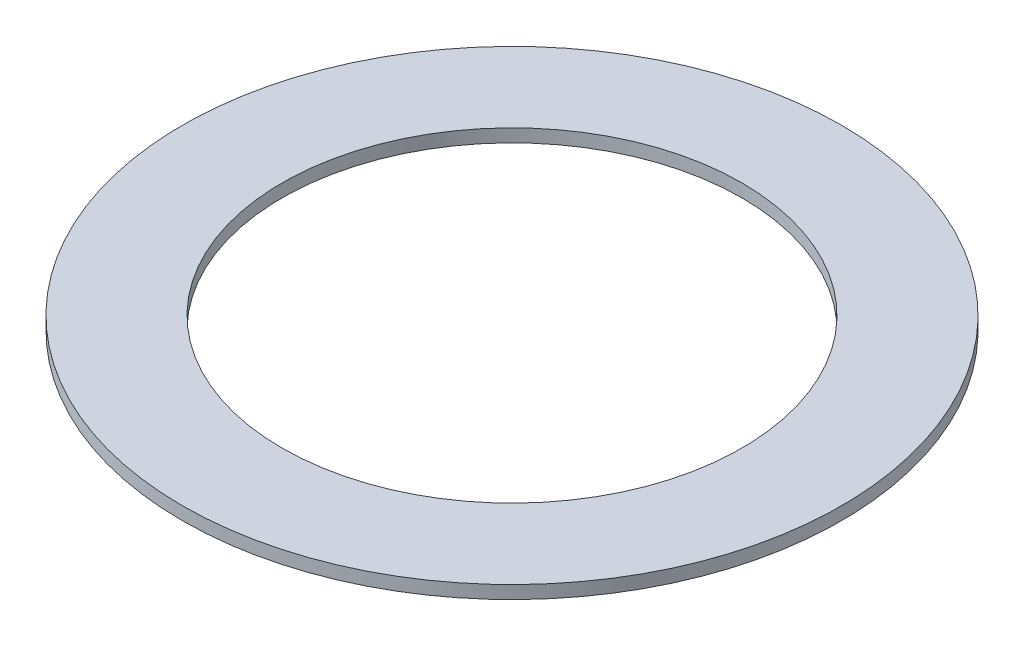
ISO-10303-21;
HEADER;
FILE_DESCRIPTION(('STEP AP214'),'2;1');
FILE_NAME('part.step','',(''),(''),'','','');
FILE_SCHEMA(('AUTOMOTIVE_DESIGN { 1 0 10303 214 1 1 1 1 }'));
ENDSEC;
DATA;
#1=APPLICATION_CONTEXT('core data for automotive mechanical design processes');
#2=APPLICATION_PROTOCOL_DEFINITION('international standard','automotive_design',2000,#1);
#3=PRODUCT_CONTEXT('',#1,'mechanical');
#4=PRODUCT('Part','Part','',(#3));
#5=PRODUCT_RELATED_PRODUCT_CATEGORY('part','',(#4));
#6=PRODUCT_DEFINITION_FORMATION('','',#4);
#7=PRODUCT_DEFINITION_CONTEXT('part definition',#1,'design');
#8=PRODUCT_DEFINITION('design','',#6,#7);
#9=PRODUCT_DEFINITION_SHAPE('','',#8);
#10=(LENGTH_UNIT() NAMED_UNIT(*) SI_UNIT(.MILLI.,.METRE.));
#11=(NAMED_UNIT(*) PLANE_ANGLE_UNIT() SI_UNIT($,.RADIAN.));
#12=(NAMED_UNIT(*) SI_UNIT($,.STERADIAN.) SOLID_ANGLE_UNIT());
#13=UNCERTAINTY_MEASURE_WITH_UNIT(LENGTH_MEASURE(1.E-05),#10,'distance_accuracy_value','');
#14=(GEOMETRIC_REPRESENTATION_CONTEXT(3) GLOBAL_UNCERTAINTY_ASSIGNED_CONTEXT((#13)) GLOBAL_UNIT_ASSIGNED_CONTEXT((#10,
#11,#12)) REPRESENTATION_CONTEXT('',''));
#15=CARTESIAN_POINT('',(0.,0.,0.));
#16=DIRECTION('',(0.,0.,1.));
#17=DIRECTION('',(1.,0.,0.));
#18=AXIS2_PLACEMENT_3D('',#15,#16,#17);
#19=CARTESIAN_POINT('',(0.,0.3,0.));
#20=DIRECTION('',(0.,1.,0.));
#21=DIRECTION('',(0.,0.,1.));
#22=AXIS2_PLACEMENT_3D('',#19,#20,#21);
#23=PLANE('',#22);
#24=CARTESIAN_POINT('',(0.,0.3,0.));
#25=DIRECTION('',(0.,1.,0.));
#26=DIRECTION('',(0.,0.,1.));
#27=AXIS2_PLACEMENT_3D('',#24,#25,#26);
#28=CIRCLE('',#27,7.6);
#29=CARTESIAN_POINT('',(0.,0.3,7.6));
#30=VERTEX_POINT('',#29);
#31=EDGE_CURVE('E10',#30,#30,#28,.T.);
#32=ORIENTED_EDGE('',*,*,#31,.T.);
#33=EDGE_LOOP('',(#32));
#34=FACE_BOUND('',#33,.T.);
#35=CARTESIAN_POINT('',(0.,0.3,0.));
#36=DIRECTION('',(0.,1.,0.));
#37=DIRECTION('',(0.,0.,1.));
#38=AXIS2_PLACEMENT_3D('',#35,#36,#37);
#39=CIRCLE('',#38,5.3);
#40=CARTESIAN_POINT('',(0.,0.3,5.3));
#41=VERTEX_POINT('',#40);
#42=EDGE_CURVE('E56',#41,#41,#39,.T.);
#43=ORIENTED_EDGE('',*,*,#42,.F.);
#44=EDGE_LOOP('',(#43));
#45=FACE_BOUND('',#44,.T.);
#46=ADVANCED_FACE('F43',(#34,#45),#23,.T.);
#47=CARTESIAN_POINT('',(0.,0.,0.));
#48=DIRECTION('',(0.,1.,0.));
#49=DIRECTION('',(0.,0.,1.));
#50=AXIS2_PLACEMENT_3D('',#47,#48,#49);
#51=PLANE('',#50);
#52=CARTESIAN_POINT('',(0.,0.,0.));
#53=DIRECTION('',(0.,1.,0.));
#54=DIRECTION('',(0.,0.,1.));
#55=AXIS2_PLACEMENT_3D('',#52,#53,#54);
#56=CIRCLE('',#55,7.6);
#57=CARTESIAN_POINT('',(0.,0.,7.6));
#58=VERTEX_POINT('',#57);
#59=EDGE_CURVE('E47',#58,#58,#56,.T.);
#60=ORIENTED_EDGE('',*,*,#59,.F.);
#61=EDGE_LOOP('',(#60));
#62=FACE_BOUND('',#61,.T.);
#63=CARTESIAN_POINT('',(0.,0.,0.));
#64=DIRECTION('',(0.,1.,0.));
#65=DIRECTION('',(0.,0.,1.));
#66=AXIS2_PLACEMENT_3D('',#63,#64,#65);
#67=CIRCLE('',#66,5.3);
#68=CARTESIAN_POINT('',(0.,0.,5.3));
#69=VERTEX_POINT('',#68);
#70=EDGE_CURVE('E58',#69,#69,#67,.T.);
#71=ORIENTED_EDGE('',*,*,#70,.T.);
#72=EDGE_LOOP('',(#71));
#73=FACE_BOUND('',#72,.T.);
#74=ADVANCED_FACE('F70',(#62,#73),#51,.F.);
#75=CARTESIAN_POINT('',(0.,0.3,0.));
#76=DIRECTION('',(0.,-1.,0.));
#77=DIRECTION('',(0.,0.,-1.));
#78=AXIS2_PLACEMENT_3D('',#75,#76,#77);
#79=CYLINDRICAL_SURFACE('',#78,7.6);
#80=ORIENTED_EDGE('',*,*,#31,.F.);
#81=EDGE_LOOP('',(#80));
#82=FACE_BOUND('',#81,.T.);
#83=ORIENTED_EDGE('',*,*,#59,.T.);
#84=EDGE_LOOP('',(#83));
#85=FACE_BOUND('',#84,.T.);
#86=ADVANCED_FACE('F45',(#82,#85),#79,.T.);
#87=CARTESIAN_POINT('',(0.,0.3,0.));
#88=DIRECTION('',(0.,-1.,0.));
#89=DIRECTION('',(0.,0.,-1.));
#90=AXIS2_PLACEMENT_3D('',#87,#88,#89);
#91=CYLINDRICAL_SURFACE('',#90,5.3);
#92=ORIENTED_EDGE('',*,*,#42,.T.);
#93=EDGE_LOOP('',(#92));
#94=FACE_BOUND('',#93,.T.);
#95=ORIENTED_EDGE('',*,*,#70,.F.);
#96=EDGE_LOOP('',(#95));
#97=FACE_BOUND('',#96,.T.);
#98=ADVANCED_FACE('F66',(#94,#97),#91,.F.);
#99=CLOSED_SHELL('',(#46,#74,#86,#98));
#100=MANIFOLD_SOLID_BREP('B2',#99);
#101=ADVANCED_BREP_SHAPE_REPRESENTATION('',(#18,#100),#14);
#102=SHAPE_DEFINITION_REPRESENTATION(#9,#101);
ENDSEC;
END-ISO-10303-21;
